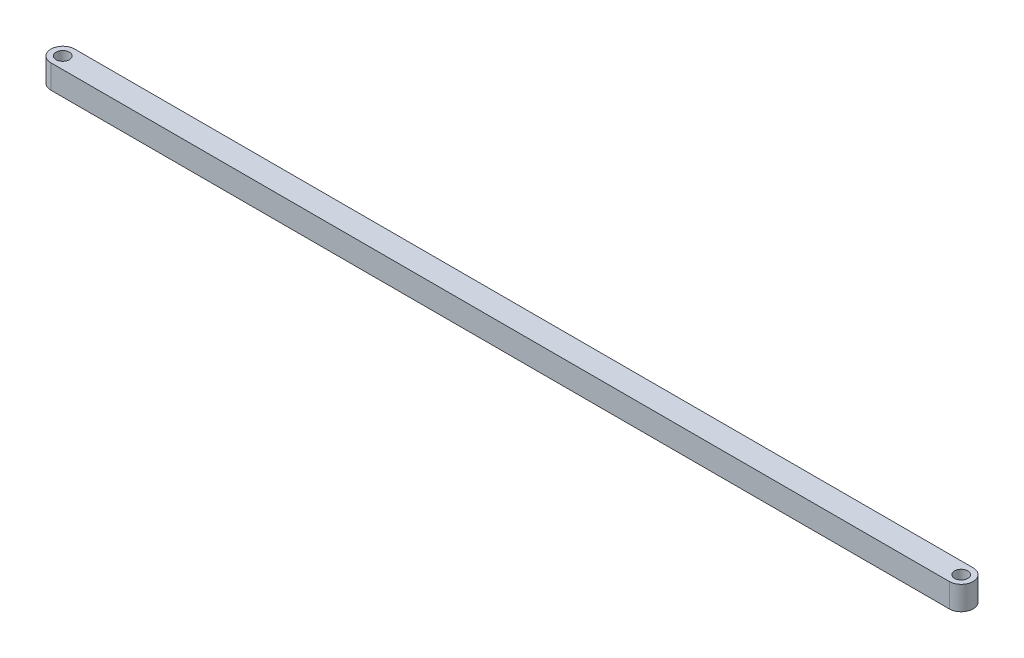
ISO-10303-21;
HEADER;
FILE_DESCRIPTION(('STEP AP214'),'2;1');
FILE_NAME('part.step','',(''),(''),'','','');
FILE_SCHEMA(('AUTOMOTIVE_DESIGN { 1 0 10303 214 1 1 1 1 }'));
ENDSEC;
DATA;
#1=APPLICATION_CONTEXT('core data for automotive mechanical design processes');
#2=APPLICATION_PROTOCOL_DEFINITION('international standard','automotive_design',2000,#1);
#3=PRODUCT_CONTEXT('',#1,'mechanical');
#4=PRODUCT('Part','Part','',(#3));
#5=PRODUCT_RELATED_PRODUCT_CATEGORY('part','',(#4));
#6=PRODUCT_DEFINITION_FORMATION('','',#4);
#7=PRODUCT_DEFINITION_CONTEXT('part definition',#1,'design');
#8=PRODUCT_DEFINITION('design','',#6,#7);
#9=PRODUCT_DEFINITION_SHAPE('','',#8);
#10=(LENGTH_UNIT() NAMED_UNIT(*) SI_UNIT(.MILLI.,.METRE.));
#11=(NAMED_UNIT(*) PLANE_ANGLE_UNIT() SI_UNIT($,.RADIAN.));
#12=(NAMED_UNIT(*) SI_UNIT($,.STERADIAN.) SOLID_ANGLE_UNIT());
#13=UNCERTAINTY_MEASURE_WITH_UNIT(LENGTH_MEASURE(1.E-05),#10,'distance_accuracy_value','');
#14=(GEOMETRIC_REPRESENTATION_CONTEXT(3) GLOBAL_UNCERTAINTY_ASSIGNED_CONTEXT((#13)) GLOBAL_UNIT_ASSIGNED_CONTEXT((#10,
#11,#12)) REPRESENTATION_CONTEXT('',''));
#15=CARTESIAN_POINT('',(0.,0.,0.));
#16=DIRECTION('',(0.,0.,1.));
#17=DIRECTION('',(1.,0.,0.));
#18=AXIS2_PLACEMENT_3D('',#15,#16,#17);
#19=CARTESIAN_POINT('',(170.,-4.5,0.));
#20=DIRECTION('',(0.,1.,0.));
#21=DIRECTION('',(0.,0.,1.));
#22=AXIS2_PLACEMENT_3D('',#19,#20,#21);
#23=CYLINDRICAL_SURFACE('',#22,4.49999999999995);
#24=CARTESIAN_POINT('',(170.,4.5,0.));
#25=DIRECTION('',(0.,1.,0.));
#26=DIRECTION('',(0.,0.,1.));
#27=AXIS2_PLACEMENT_3D('',#24,#25,#26);
#28=CIRCLE('',#27,4.49999999999995);
#29=CARTESIAN_POINT('',(170.,4.5,4.4999999999999));
#30=VERTEX_POINT('',#29);
#31=CARTESIAN_POINT('',(170.,4.5,-4.5));
#32=VERTEX_POINT('',#31);
#33=EDGE_CURVE('E104',#30,#32,#28,.T.);
#34=ORIENTED_EDGE('',*,*,#33,.F.);
#35=DIRECTION('',(0.,1.,0.));
#36=VECTOR('',#35,1.);
#37=CARTESIAN_POINT('',(170.,-4.5,4.4999999999999));
#38=LINE('',#37,#36);
#39=CARTESIAN_POINT('',(170.,-4.5,4.4999999999999));
#40=VERTEX_POINT('',#39);
#41=EDGE_CURVE('E11',#40,#30,#38,.T.);
#42=ORIENTED_EDGE('',*,*,#41,.F.);
#43=CARTESIAN_POINT('',(170.,-4.5,0.));
#44=DIRECTION('',(0.,1.,0.));
#45=DIRECTION('',(0.,0.,1.));
#46=AXIS2_PLACEMENT_3D('',#43,#44,#45);
#47=CIRCLE('',#46,4.49999999999995);
#48=CARTESIAN_POINT('',(170.,-4.5,-4.5));
#49=VERTEX_POINT('',#48);
#50=EDGE_CURVE('E97',#40,#49,#47,.T.);
#51=ORIENTED_EDGE('',*,*,#50,.T.);
#52=DIRECTION('',(0.,1.,0.));
#53=VECTOR('',#52,1.);
#54=CARTESIAN_POINT('',(170.,-4.5,-4.5));
#55=LINE('',#54,#53);
#56=EDGE_CURVE('E42',#49,#32,#55,.T.);
#57=ORIENTED_EDGE('',*,*,#56,.T.);
#58=EDGE_LOOP('',(#34,#42,#51,#57));
#59=FACE_BOUND('',#58,.T.);
#60=ADVANCED_FACE('F39',(#59),#23,.T.);
#61=CARTESIAN_POINT('',(-170.,-4.5,4.50000000000007));
#62=DIRECTION('',(0.,0.,1.));
#63=DIRECTION('',(1.,0.,0.));
#64=AXIS2_PLACEMENT_3D('',#61,#62,#63);
#65=PLANE('',#64);
#66=DIRECTION('',(1.,0.,0.));
#67=VECTOR('',#66,1.);
#68=CARTESIAN_POINT('',(-170.,4.5,4.50000000000007));
#69=LINE('',#68,#67);
#70=CARTESIAN_POINT('',(-170.,4.5,4.50000000000004));
#71=VERTEX_POINT('',#70);
#72=EDGE_CURVE('E99',#71,#30,#69,.T.);
#73=ORIENTED_EDGE('',*,*,#72,.F.);
#74=DIRECTION('',(0.,1.,0.));
#75=VECTOR('',#74,1.);
#76=CARTESIAN_POINT('',(-170.,-4.5,4.50000000000004));
#77=LINE('',#76,#75);
#78=CARTESIAN_POINT('',(-170.,-4.5,4.50000000000004));
#79=VERTEX_POINT('',#78);
#80=EDGE_CURVE('E48',#79,#71,#77,.T.);
#81=ORIENTED_EDGE('',*,*,#80,.F.);
#82=DIRECTION('',(1.,0.,0.));
#83=VECTOR('',#82,1.);
#84=CARTESIAN_POINT('',(-170.,-4.5,4.50000000000007));
#85=LINE('',#84,#83);
#86=EDGE_CURVE('E94',#79,#40,#85,.T.);
#87=ORIENTED_EDGE('',*,*,#86,.T.);
#88=ORIENTED_EDGE('',*,*,#41,.T.);
#89=EDGE_LOOP('',(#73,#81,#87,#88));
#90=FACE_BOUND('',#89,.T.);
#91=ADVANCED_FACE('F115',(#90),#65,.T.);
#92=CARTESIAN_POINT('',(-170.,-4.5,0.));
#93=DIRECTION('',(0.,1.,0.));
#94=DIRECTION('',(0.,0.,1.));
#95=AXIS2_PLACEMENT_3D('',#92,#93,#94);
#96=CYLINDRICAL_SURFACE('',#95,4.50000000000004);
#97=CARTESIAN_POINT('',(-170.,4.5,0.));
#98=DIRECTION('',(0.,1.,0.));
#99=DIRECTION('',(0.,0.,1.));
#100=AXIS2_PLACEMENT_3D('',#97,#98,#99);
#101=CIRCLE('',#100,4.50000000000004);
#102=CARTESIAN_POINT('',(-170.,4.5,-4.5));
#103=VERTEX_POINT('',#102);
#104=EDGE_CURVE('E89',#103,#71,#101,.T.);
#105=ORIENTED_EDGE('',*,*,#104,.F.);
#106=DIRECTION('',(0.,1.,0.));
#107=VECTOR('',#106,1.);
#108=CARTESIAN_POINT('',(-170.,-4.5,-4.5));
#109=LINE('',#108,#107);
#110=CARTESIAN_POINT('',(-170.,-4.5,-4.5));
#111=VERTEX_POINT('',#110);
#112=EDGE_CURVE('E84',#111,#103,#109,.T.);
#113=ORIENTED_EDGE('',*,*,#112,.F.);
#114=CARTESIAN_POINT('',(-170.,-4.5,0.));
#115=DIRECTION('',(0.,1.,0.));
#116=DIRECTION('',(0.,0.,1.));
#117=AXIS2_PLACEMENT_3D('',#114,#115,#116);
#118=CIRCLE('',#117,4.50000000000004);
#119=EDGE_CURVE('E87',#111,#79,#118,.T.);
#120=ORIENTED_EDGE('',*,*,#119,.T.);
#121=ORIENTED_EDGE('',*,*,#80,.T.);
#122=EDGE_LOOP('',(#105,#113,#120,#121));
#123=FACE_BOUND('',#122,.T.);
#124=ADVANCED_FACE('F86',(#123),#96,.T.);
#125=CARTESIAN_POINT('',(170.,-4.5,-4.5));
#126=DIRECTION('',(0.,0.,-1.));
#127=DIRECTION('',(-1.,0.,0.));
#128=AXIS2_PLACEMENT_3D('',#125,#126,#127);
#129=PLANE('',#128);
#130=DIRECTION('',(-1.,0.,0.));
#131=VECTOR('',#130,1.);
#132=CARTESIAN_POINT('',(170.,4.5,-4.5));
#133=LINE('',#132,#131);
#134=EDGE_CURVE('E107',#32,#103,#133,.T.);
#135=ORIENTED_EDGE('',*,*,#134,.F.);
#136=ORIENTED_EDGE('',*,*,#56,.F.);
#137=DIRECTION('',(-1.,0.,0.));
#138=VECTOR('',#137,1.);
#139=CARTESIAN_POINT('',(170.,-4.5,-4.5));
#140=LINE('',#139,#138);
#141=EDGE_CURVE('E93',#49,#111,#140,.T.);
#142=ORIENTED_EDGE('',*,*,#141,.T.);
#143=ORIENTED_EDGE('',*,*,#112,.T.);
#144=EDGE_LOOP('',(#135,#136,#142,#143));
#145=FACE_BOUND('',#144,.T.);
#146=ADVANCED_FACE('F96',(#145),#129,.T.);
#147=CARTESIAN_POINT('',(170.,-4.5,0.));
#148=DIRECTION('',(0.,1.,0.));
#149=DIRECTION('',(0.,0.,1.));
#150=AXIS2_PLACEMENT_3D('',#147,#148,#149);
#151=PLANE('',#150);
#152=CARTESIAN_POINT('',(-170.,-4.5,0.));
#153=DIRECTION('',(0.,1.,0.));
#154=DIRECTION('',(0.,0.,-1.));
#155=AXIS2_PLACEMENT_3D('',#152,#153,#154);
#156=CIRCLE('',#155,2.5);
#157=CARTESIAN_POINT('',(-170.,-4.5,-2.5));
#158=VERTEX_POINT('',#157);
#159=EDGE_CURVE('E148',#158,#158,#156,.T.);
#160=ORIENTED_EDGE('',*,*,#159,.T.);
#161=EDGE_LOOP('',(#160));
#162=FACE_BOUND('',#161,.T.);
#163=CARTESIAN_POINT('',(170.,-4.5,0.));
#164=DIRECTION('',(0.,1.,0.));
#165=DIRECTION('',(0.,0.,-1.));
#166=AXIS2_PLACEMENT_3D('',#163,#164,#165);
#167=CIRCLE('',#166,2.5);
#168=CARTESIAN_POINT('',(170.,-4.5,-2.5));
#169=VERTEX_POINT('',#168);
#170=EDGE_CURVE('E108',#169,#169,#167,.T.);
#171=ORIENTED_EDGE('',*,*,#170,.T.);
#172=EDGE_LOOP('',(#171));
#173=FACE_BOUND('',#172,.T.);
#174=ORIENTED_EDGE('',*,*,#50,.F.);
#175=ORIENTED_EDGE('',*,*,#86,.F.);
#176=ORIENTED_EDGE('',*,*,#119,.F.);
#177=ORIENTED_EDGE('',*,*,#141,.F.);
#178=EDGE_LOOP('',(#174,#175,#176,#177));
#179=FACE_BOUND('',#178,.T.);
#180=ADVANCED_FACE('F92',(#162,#173,#179),#151,.F.);
#181=CARTESIAN_POINT('',(170.,4.5,0.));
#182=DIRECTION('',(0.,1.,0.));
#183=DIRECTION('',(0.,0.,1.));
#184=AXIS2_PLACEMENT_3D('',#181,#182,#183);
#185=PLANE('',#184);
#186=CARTESIAN_POINT('',(-170.,4.5,0.));
#187=DIRECTION('',(0.,1.,0.));
#188=DIRECTION('',(0.,0.,-1.));
#189=AXIS2_PLACEMENT_3D('',#186,#187,#188);
#190=CIRCLE('',#189,2.5);
#191=CARTESIAN_POINT('',(-170.,4.5,-2.5));
#192=VERTEX_POINT('',#191);
#193=EDGE_CURVE('E151',#192,#192,#190,.T.);
#194=ORIENTED_EDGE('',*,*,#193,.F.);
#195=EDGE_LOOP('',(#194));
#196=FACE_BOUND('',#195,.T.);
#197=CARTESIAN_POINT('',(170.,4.5,0.));
#198=DIRECTION('',(0.,1.,0.));
#199=DIRECTION('',(0.,0.,-1.));
#200=AXIS2_PLACEMENT_3D('',#197,#198,#199);
#201=CIRCLE('',#200,2.5);
#202=CARTESIAN_POINT('',(170.,4.5,-2.5));
#203=VERTEX_POINT('',#202);
#204=EDGE_CURVE('E153',#203,#203,#201,.T.);
#205=ORIENTED_EDGE('',*,*,#204,.F.);
#206=EDGE_LOOP('',(#205));
#207=FACE_BOUND('',#206,.T.);
#208=ORIENTED_EDGE('',*,*,#33,.T.);
#209=ORIENTED_EDGE('',*,*,#134,.T.);
#210=ORIENTED_EDGE('',*,*,#104,.T.);
#211=ORIENTED_EDGE('',*,*,#72,.T.);
#212=EDGE_LOOP('',(#208,#209,#210,#211));
#213=FACE_BOUND('',#212,.T.);
#214=ADVANCED_FACE('F114',(#196,#207,#213),#185,.T.);
#215=CARTESIAN_POINT('',(170.,-4.5,0.));
#216=DIRECTION('',(0.,1.,0.));
#217=DIRECTION('',(0.,0.,1.));
#218=AXIS2_PLACEMENT_3D('',#215,#216,#217);
#219=CYLINDRICAL_SURFACE('',#218,2.5);
#220=ORIENTED_EDGE('',*,*,#170,.F.);
#221=EDGE_LOOP('',(#220));
#222=FACE_BOUND('',#221,.T.);
#223=ORIENTED_EDGE('',*,*,#204,.T.);
#224=EDGE_LOOP('',(#223));
#225=FACE_BOUND('',#224,.T.);
#226=ADVANCED_FACE('F133',(#222,#225),#219,.F.);
#227=CARTESIAN_POINT('',(-170.,-4.5,0.));
#228=DIRECTION('',(0.,1.,0.));
#229=DIRECTION('',(0.,0.,1.));
#230=AXIS2_PLACEMENT_3D('',#227,#228,#229);
#231=CYLINDRICAL_SURFACE('',#230,2.5);
#232=ORIENTED_EDGE('',*,*,#159,.F.);
#233=EDGE_LOOP('',(#232));
#234=FACE_BOUND('',#233,.T.);
#235=ORIENTED_EDGE('',*,*,#193,.T.);
#236=EDGE_LOOP('',(#235));
#237=FACE_BOUND('',#236,.T.);
#238=ADVANCED_FACE('F140',(#234,#237),#231,.F.);
#239=CLOSED_SHELL('',(#60,#91,#124,#146,#180,#214,#226,#238));
#240=MANIFOLD_SOLID_BREP('B2',#239);
#241=ADVANCED_BREP_SHAPE_REPRESENTATION('',(#18,#240),#14);
#242=SHAPE_DEFINITION_REPRESENTATION(#9,#241);
ENDSEC;
END-ISO-10303-21;
